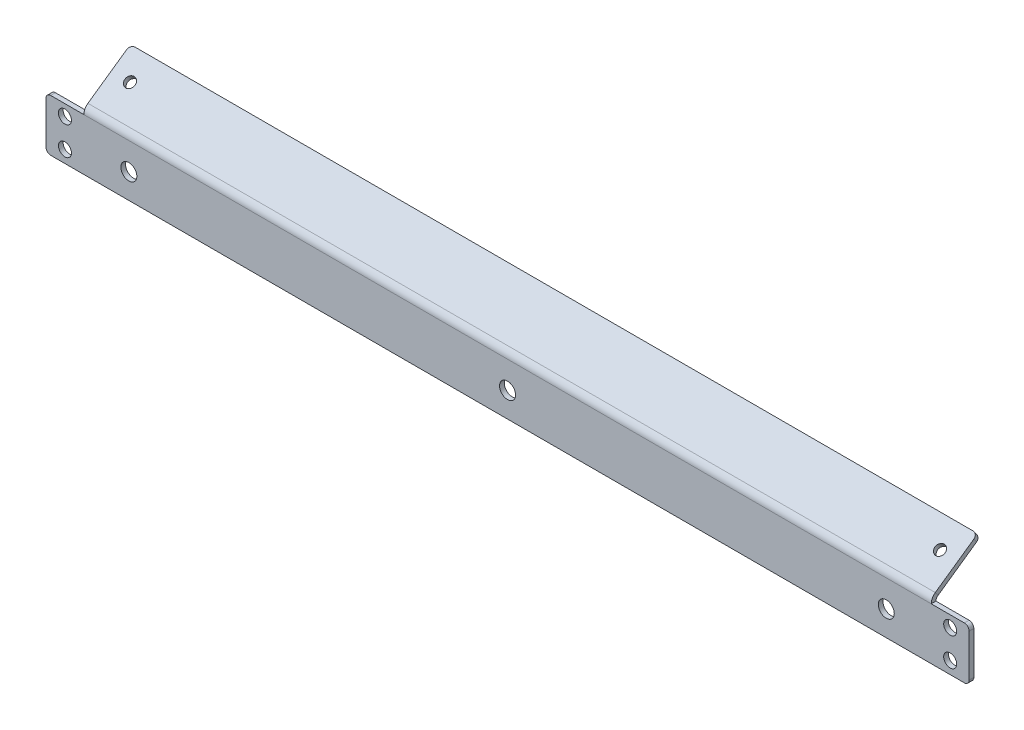
ISO-10303-21;
HEADER;
FILE_DESCRIPTION(('STEP AP214'),'2;1');
FILE_NAME('part.step','',(''),(''),'','','');
FILE_SCHEMA(('AUTOMOTIVE_DESIGN { 1 0 10303 214 1 1 1 1 }'));
ENDSEC;
DATA;
#1=APPLICATION_CONTEXT('core data for automotive mechanical design processes');
#2=APPLICATION_PROTOCOL_DEFINITION('international standard','automotive_design',2000,#1);
#3=PRODUCT_CONTEXT('',#1,'mechanical');
#4=PRODUCT('Part','Part','',(#3));
#5=PRODUCT_RELATED_PRODUCT_CATEGORY('part','',(#4));
#6=PRODUCT_DEFINITION_FORMATION('','',#4);
#7=PRODUCT_DEFINITION_CONTEXT('part definition',#1,'design');
#8=PRODUCT_DEFINITION('design','',#6,#7);
#9=PRODUCT_DEFINITION_SHAPE('','',#8);
#10=(LENGTH_UNIT() NAMED_UNIT(*) SI_UNIT(.MILLI.,.METRE.));
#11=(NAMED_UNIT(*) PLANE_ANGLE_UNIT() SI_UNIT($,.RADIAN.));
#12=(NAMED_UNIT(*) SI_UNIT($,.STERADIAN.) SOLID_ANGLE_UNIT());
#13=UNCERTAINTY_MEASURE_WITH_UNIT(LENGTH_MEASURE(1.E-05),#10,'distance_accuracy_value','');
#14=(GEOMETRIC_REPRESENTATION_CONTEXT(3) GLOBAL_UNCERTAINTY_ASSIGNED_CONTEXT((#13)) GLOBAL_UNIT_ASSIGNED_CONTEXT((#10,
#11,#12)) REPRESENTATION_CONTEXT('',''));
#15=CARTESIAN_POINT('',(0.,0.,0.));
#16=DIRECTION('',(0.,0.,1.));
#17=DIRECTION('',(1.,0.,0.));
#18=AXIS2_PLACEMENT_3D('',#15,#16,#17);
#19=CARTESIAN_POINT('',(612.775,34.7943992289964,-33.0307980728252));
#20=DIRECTION('',(-1.,0.,0.));
#21=DIRECTION('',(0.,0.,1.));
#22=AXIS2_PLACEMENT_3D('',#19,#20,#21);
#23=PLANE('',#22);
#24=DIRECTION('',(0.,-0.573576436351045,0.819152044288993));
#25=VECTOR('',#24,1.);
#26=CARTESIAN_POINT('',(612.775,35.4991922593825,-1.82110518541457));
#27=LINE('',#26,#25);
#28=CARTESIAN_POINT('',(612.775,55.5313492989427,-30.4299903322076));
#29=VERTEX_POINT('',#28);
#30=CARTESIAN_POINT('',(612.775,37.3952069696139,-4.52889481458543));
#31=VERTEX_POINT('',#30);
#32=EDGE_CURVE('E483',#29,#31,#27,.T.);
#33=ORIENTED_EDGE('',*,*,#32,.F.);
#34=DIRECTION('',(0.,0.819152044288992,0.573576436351046));
#35=VECTOR('',#34,1.);
#36=CARTESIAN_POINT('',(612.775,58.1321570395602,-28.6088851467931));
#37=LINE('',#36,#35);
#38=CARTESIAN_POINT('',(612.775,58.1321570395602,-28.6088851467931));
#39=VERTEX_POINT('',#38);
#40=EDGE_CURVE('E399',#29,#39,#37,.T.);
#41=ORIENTED_EDGE('',*,*,#40,.T.);
#42=DIRECTION('',(0.,-0.573576436351045,0.819152044288993));
#43=VECTOR('',#42,1.);
#44=CARTESIAN_POINT('',(612.775,38.1,0.));
#45=LINE('',#44,#43);
#46=CARTESIAN_POINT('',(612.775,39.9960147102315,-2.70778962917086));
#47=VERTEX_POINT('',#46);
#48=EDGE_CURVE('E272',#39,#47,#45,.T.);
#49=ORIENTED_EDGE('',*,*,#48,.T.);
#50=DIRECTION('',(0.,-0.819152044288993,-0.573576436351044));
#51=VECTOR('',#50,1.);
#52=CARTESIAN_POINT('',(612.775,39.9960147102315,-2.70778962917086));
#53=LINE('',#52,#51);
#54=EDGE_CURVE('E266',#47,#31,#53,.T.);
#55=ORIENTED_EDGE('',*,*,#54,.T.);
#56=EDGE_LOOP('',(#33,#41,#49,#55));
#57=FACE_BOUND('',#56,.T.);
#58=ADVANCED_FACE('F125',(#57),#23,.F.);
#59=CARTESIAN_POINT('',(638.175,35.4991922593825,-1.82110518541457));
#60=DIRECTION('',(0.,0.819152044288993,0.573576436351045));
#61=DIRECTION('',(0.,-0.573576436351045,0.819152044288993));
#62=AXIS2_PLACEMENT_3D('',#59,#60,#61);
#63=PLANE('',#62);
#64=CARTESIAN_POINT('',(57.15,48.2469285572844,-20.0267593697374));
#65=DIRECTION('',(0.,0.819152044288993,0.573576436351045));
#66=DIRECTION('',(0.,-0.573576436351045,0.819152044288993));
#67=AXIS2_PLACEMENT_3D('',#64,#65,#66);
#68=CIRCLE('',#67,3.429);
#69=CARTESIAN_POINT('',(57.15,46.2801349570367,-17.2178870098705));
#70=VERTEX_POINT('',#69);
#71=EDGE_CURVE('E899',#70,#70,#68,.T.);
#72=ORIENTED_EDGE('',*,*,#71,.T.);
#73=EDGE_LOOP('',(#72));
#74=FACE_BOUND('',#73,.T.);
#75=CARTESIAN_POINT('',(600.456,48.2469285572844,-20.0267593697374));
#76=DIRECTION('',(0.,0.819152044288993,0.573576436351045));
#77=DIRECTION('',(0.,-0.573576436351045,0.819152044288993));
#78=AXIS2_PLACEMENT_3D('',#75,#76,#77);
#79=CIRCLE('',#78,3.429);
#80=CARTESIAN_POINT('',(600.456,46.2801349570367,-17.2178870098705));
#81=VERTEX_POINT('',#80);
#82=EDGE_CURVE('E904',#81,#81,#79,.T.);
#83=ORIENTED_EDGE('',*,*,#82,.T.);
#84=EDGE_LOOP('',(#83));
#85=FACE_BOUND('',#84,.T.);
#86=DIRECTION('',(0.,0.573576436351045,-0.819152044288993));
#87=VECTOR('',#86,1.);
#88=CARTESIAN_POINT('',(44.45,35.4991922593825,-1.82110518541457));
#89=LINE('',#88,#87);
#90=CARTESIAN_POINT('',(44.45,37.3952069696139,-4.52889481458543));
#91=VERTEX_POINT('',#90);
#92=CARTESIAN_POINT('',(44.45,55.5313492989427,-30.4299903322076));
#93=VERTEX_POINT('',#92);
#94=EDGE_CURVE('E473',#91,#93,#89,.T.);
#95=ORIENTED_EDGE('',*,*,#94,.T.);
#96=CARTESIAN_POINT('',(47.625,55.5313492989427,-30.4299903322076));
#97=DIRECTION('',(0.,0.819152044288993,0.573576436351045));
#98=DIRECTION('',(0.,-0.573576436351045,0.819152044288993));
#99=AXIS2_PLACEMENT_3D('',#96,#97,#98);
#100=CIRCLE('',#99,3.175);
#101=CARTESIAN_POINT('',(47.625,57.3524544843573,-33.0307980728252));
#102=VERTEX_POINT('',#101);
#103=EDGE_CURVE('E386',#93,#102,#100,.F.);
#104=ORIENTED_EDGE('',*,*,#103,.T.);
#105=DIRECTION('',(-1.,0.,0.));
#106=VECTOR('',#105,1.);
#107=CARTESIAN_POINT('',(638.175,57.3524544843573,-33.0307980728252));
#108=LINE('',#107,#106);
#109=CARTESIAN_POINT('',(609.6,57.3524544843573,-33.0307980728252));
#110=VERTEX_POINT('',#109);
#111=EDGE_CURVE('E298',#110,#102,#108,.T.);
#112=ORIENTED_EDGE('',*,*,#111,.F.);
#113=CARTESIAN_POINT('',(609.6,55.5313492989427,-30.4299903322076));
#114=DIRECTION('',(0.,0.819152044288993,0.573576436351045));
#115=DIRECTION('',(0.,-0.573576436351045,0.819152044288993));
#116=AXIS2_PLACEMENT_3D('',#113,#114,#115);
#117=CIRCLE('',#116,3.175);
#118=EDGE_CURVE('E383',#110,#29,#117,.F.);
#119=ORIENTED_EDGE('',*,*,#118,.T.);
#120=ORIENTED_EDGE('',*,*,#32,.T.);
#121=DIRECTION('',(-1.,0.,0.));
#122=VECTOR('',#121,1.);
#123=CARTESIAN_POINT('',(638.175,37.395206969614,-4.52889481458542));
#124=LINE('',#123,#122);
#125=EDGE_CURVE('E422',#31,#91,#124,.T.);
#126=ORIENTED_EDGE('',*,*,#125,.T.);
#127=EDGE_LOOP('',(#95,#104,#112,#119,#120,#126));
#128=FACE_BOUND('',#127,.T.);
#129=ADVANCED_FACE('F501',(#74,#85,#128),#63,.F.);
#130=CARTESIAN_POINT('',(638.175,59.9532622249748,-31.2096928874106));
#131=DIRECTION('',(0.,0.573576436351045,-0.819152044288992));
#132=DIRECTION('',(0.,0.819152044288992,0.573576436351046));
#133=AXIS2_PLACEMENT_3D('',#130,#131,#132);
#134=PLANE('',#133);
#135=ORIENTED_EDGE('',*,*,#111,.T.);
#136=DIRECTION('',(0.,-0.819152044288992,-0.573576436351046));
#137=VECTOR('',#136,1.);
#138=CARTESIAN_POINT('',(47.625,59.9532622249748,-31.2096928874106));
#139=LINE('',#138,#137);
#140=CARTESIAN_POINT('',(47.625,59.9532622249748,-31.2096928874106));
#141=VERTEX_POINT('',#140);
#142=EDGE_CURVE('E149',#102,#141,#139,.F.);
#143=ORIENTED_EDGE('',*,*,#142,.T.);
#144=DIRECTION('',(-1.,0.,0.));
#145=VECTOR('',#144,1.);
#146=CARTESIAN_POINT('',(638.175,59.9532622249748,-31.2096928874106));
#147=LINE('',#146,#145);
#148=CARTESIAN_POINT('',(609.6,59.9532622249748,-31.2096928874106));
#149=VERTEX_POINT('',#148);
#150=EDGE_CURVE('E295',#149,#141,#147,.T.);
#151=ORIENTED_EDGE('',*,*,#150,.F.);
#152=DIRECTION('',(0.,0.819152044288992,0.573576436351046));
#153=VECTOR('',#152,1.);
#154=CARTESIAN_POINT('',(609.6,57.3524544843573,-33.0307980728252));
#155=LINE('',#154,#153);
#156=EDGE_CURVE('E389',#149,#110,#155,.F.);
#157=ORIENTED_EDGE('',*,*,#156,.T.);
#158=EDGE_LOOP('',(#135,#143,#151,#157));
#159=FACE_BOUND('',#158,.T.);
#160=ADVANCED_FACE('F503',(#159),#134,.T.);
#161=CARTESIAN_POINT('',(638.175,38.1,0.));
#162=DIRECTION('',(0.,0.819152044288993,0.573576436351045));
#163=DIRECTION('',(0.,-0.573576436351045,0.819152044288993));
#164=AXIS2_PLACEMENT_3D('',#161,#162,#163);
#165=PLANE('',#164);
#166=CARTESIAN_POINT('',(57.15,50.847736297902,-18.2056541843229));
#167=DIRECTION('',(0.,0.819152044288993,0.573576436351045));
#168=DIRECTION('',(0.,-0.573576436351045,0.819152044288993));
#169=AXIS2_PLACEMENT_3D('',#166,#167,#168);
#170=CIRCLE('',#169,3.429);
#171=CARTESIAN_POINT('',(57.15,48.8809426976542,-15.3967818244559));
#172=VERTEX_POINT('',#171);
#173=EDGE_CURVE('E902',#172,#172,#170,.T.);
#174=ORIENTED_EDGE('',*,*,#173,.F.);
#175=EDGE_LOOP('',(#174));
#176=FACE_BOUND('',#175,.T.);
#177=CARTESIAN_POINT('',(600.456,50.847736297902,-18.2056541843229));
#178=DIRECTION('',(0.,0.819152044288993,0.573576436351045));
#179=DIRECTION('',(0.,-0.573576436351045,0.819152044288993));
#180=AXIS2_PLACEMENT_3D('',#177,#178,#179);
#181=CIRCLE('',#180,3.429);
#182=CARTESIAN_POINT('',(600.456,48.8809426976542,-15.3967818244559));
#183=VERTEX_POINT('',#182);
#184=EDGE_CURVE('E912',#183,#183,#181,.T.);
#185=ORIENTED_EDGE('',*,*,#184,.F.);
#186=EDGE_LOOP('',(#185));
#187=FACE_BOUND('',#186,.T.);
#188=ORIENTED_EDGE('',*,*,#150,.T.);
#189=CARTESIAN_POINT('',(47.625,58.1321570395602,-28.6088851467931));
#190=DIRECTION('',(0.,0.819152044288993,0.573576436351045));
#191=DIRECTION('',(0.,-0.573576436351045,0.819152044288993));
#192=AXIS2_PLACEMENT_3D('',#189,#190,#191);
#193=CIRCLE('',#192,3.175);
#194=CARTESIAN_POINT('',(44.45,58.1321570395602,-28.6088851467931));
#195=VERTEX_POINT('',#194);
#196=EDGE_CURVE('E396',#141,#195,#193,.T.);
#197=ORIENTED_EDGE('',*,*,#196,.T.);
#198=DIRECTION('',(0.,0.573576436351045,-0.819152044288993));
#199=VECTOR('',#198,1.);
#200=CARTESIAN_POINT('',(44.45,38.1,0.));
#201=LINE('',#200,#199);
#202=CARTESIAN_POINT('',(44.45,39.9960147102315,-2.70778962917086));
#203=VERTEX_POINT('',#202);
#204=EDGE_CURVE('E477',#203,#195,#201,.T.);
#205=ORIENTED_EDGE('',*,*,#204,.F.);
#206=DIRECTION('',(-1.,0.,0.));
#207=VECTOR('',#206,1.);
#208=CARTESIAN_POINT('',(638.175,39.9960147102315,-2.70778962917086));
#209=LINE('',#208,#207);
#210=EDGE_CURVE('E254',#47,#203,#209,.T.);
#211=ORIENTED_EDGE('',*,*,#210,.F.);
#212=ORIENTED_EDGE('',*,*,#48,.F.);
#213=CARTESIAN_POINT('',(609.6,58.1321570395602,-28.6088851467931));
#214=DIRECTION('',(0.,0.819152044288993,0.573576436351045));
#215=DIRECTION('',(0.,-0.573576436351045,0.819152044288993));
#216=AXIS2_PLACEMENT_3D('',#213,#214,#215);
#217=CIRCLE('',#216,3.175);
#218=EDGE_CURVE('E141',#39,#149,#217,.T.);
#219=ORIENTED_EDGE('',*,*,#218,.T.);
#220=EDGE_LOOP('',(#188,#197,#205,#211,#212,#219));
#221=FACE_BOUND('',#220,.T.);
#222=ADVANCED_FACE('F491',(#176,#187,#221),#165,.T.);
#223=CARTESIAN_POINT('',(638.175,34.7943992289964,-6.35));
#224=DIRECTION('',(-1.,0.,0.));
#225=DIRECTION('',(0.,0.,1.));
#226=AXIS2_PLACEMENT_3D('',#223,#224,#225);
#227=CYLINDRICAL_SURFACE('',#226,6.35);
#228=CARTESIAN_POINT('',(612.775,34.7943992289964,-6.35));
#229=DIRECTION('',(-1.,0.,0.));
#230=DIRECTION('',(0.,0.,1.));
#231=AXIS2_PLACEMENT_3D('',#228,#229,#230);
#232=CIRCLE('',#231,6.35);
#233=CARTESIAN_POINT('',(612.775,34.7943992289964,0.));
#234=VERTEX_POINT('',#233);
#235=EDGE_CURVE('E260',#47,#234,#232,.F.);
#236=ORIENTED_EDGE('',*,*,#235,.F.);
#237=ORIENTED_EDGE('',*,*,#210,.T.);
#238=CARTESIAN_POINT('',(44.45,34.7943992289964,-6.35));
#239=DIRECTION('',(1.,0.,0.));
#240=DIRECTION('',(0.,0.,-1.));
#241=AXIS2_PLACEMENT_3D('',#238,#239,#240);
#242=CIRCLE('',#241,6.35);
#243=CARTESIAN_POINT('',(44.45,34.7943992289964,0.));
#244=VERTEX_POINT('',#243);
#245=EDGE_CURVE('E283',#244,#203,#242,.F.);
#246=ORIENTED_EDGE('',*,*,#245,.F.);
#247=DIRECTION('',(-1.,0.,0.));
#248=VECTOR('',#247,1.);
#249=CARTESIAN_POINT('',(638.175,34.7943992289964,0.));
#250=LINE('',#249,#248);
#251=EDGE_CURVE('E247',#234,#244,#250,.T.);
#252=ORIENTED_EDGE('',*,*,#251,.F.);
#253=EDGE_LOOP('',(#236,#237,#246,#252));
#254=FACE_BOUND('',#253,.T.);
#255=ADVANCED_FACE('F282',(#254),#227,.T.);
#256=CARTESIAN_POINT('',(638.175,0.,0.));
#257=DIRECTION('',(0.,0.,1.));
#258=DIRECTION('',(1.,0.,0.));
#259=AXIS2_PLACEMENT_3D('',#256,#257,#258);
#260=PLANE('',#259);
#261=CARTESIAN_POINT('',(74.6124999999999,16.6920911299752,0.));
#262=DIRECTION('',(0.,0.,1.));
#263=DIRECTION('',(1.,0.,0.));
#264=AXIS2_PLACEMENT_3D('',#261,#262,#263);
#265=CIRCLE('',#264,5.3578125);
#266=CARTESIAN_POINT('',(79.9703124999999,16.6920911299752,0.));
#267=VERTEX_POINT('',#266);
#268=EDGE_CURVE('E278',#267,#267,#265,.T.);
#269=ORIENTED_EDGE('',*,*,#268,.F.);
#270=EDGE_LOOP('',(#269));
#271=FACE_BOUND('',#270,.T.);
#272=CARTESIAN_POINT('',(31.75,27.305,0.));
#273=DIRECTION('',(0.,0.,1.));
#274=DIRECTION('',(1.,0.,0.));
#275=AXIS2_PLACEMENT_3D('',#272,#273,#274);
#276=CIRCLE('',#275,4.3688);
#277=CARTESIAN_POINT('',(36.1188,27.305,0.));
#278=VERTEX_POINT('',#277);
#279=EDGE_CURVE('E279',#278,#278,#276,.T.);
#280=ORIENTED_EDGE('',*,*,#279,.F.);
#281=EDGE_LOOP('',(#280));
#282=FACE_BOUND('',#281,.T.);
#283=CARTESIAN_POINT('',(31.7499999999999,8.255,0.));
#284=DIRECTION('',(0.,0.,1.));
#285=DIRECTION('',(1.,0.,0.));
#286=AXIS2_PLACEMENT_3D('',#283,#284,#285);
#287=CIRCLE('',#286,4.3688);
#288=CARTESIAN_POINT('',(36.1187999999999,8.255,0.));
#289=VERTEX_POINT('',#288);
#290=EDGE_CURVE('E465',#289,#289,#287,.T.);
#291=ORIENTED_EDGE('',*,*,#290,.F.);
#292=EDGE_LOOP('',(#291));
#293=FACE_BOUND('',#292,.T.);
#294=CARTESIAN_POINT('',(625.475,27.305,0.));
#295=DIRECTION('',(0.,0.,1.));
#296=DIRECTION('',(1.,0.,0.));
#297=AXIS2_PLACEMENT_3D('',#294,#295,#296);
#298=CIRCLE('',#297,4.36879999999994);
#299=CARTESIAN_POINT('',(629.8438,27.305,0.));
#300=VERTEX_POINT('',#299);
#301=EDGE_CURVE('E918',#300,#300,#298,.T.);
#302=ORIENTED_EDGE('',*,*,#301,.F.);
#303=EDGE_LOOP('',(#302));
#304=FACE_BOUND('',#303,.T.);
#305=CARTESIAN_POINT('',(625.475,8.255,0.));
#306=DIRECTION('',(0.,0.,1.));
#307=DIRECTION('',(1.,0.,0.));
#308=AXIS2_PLACEMENT_3D('',#305,#306,#307);
#309=CIRCLE('',#308,4.36879999999994);
#310=CARTESIAN_POINT('',(629.8438,8.255,0.));
#311=VERTEX_POINT('',#310);
#312=EDGE_CURVE('E922',#311,#311,#309,.T.);
#313=ORIENTED_EDGE('',*,*,#312,.F.);
#314=EDGE_LOOP('',(#313));
#315=FACE_BOUND('',#314,.T.);
#316=CARTESIAN_POINT('',(328.6125,16.6920911299752,0.));
#317=DIRECTION('',(0.,0.,1.));
#318=DIRECTION('',(1.,0.,0.));
#319=AXIS2_PLACEMENT_3D('',#316,#317,#318);
#320=CIRCLE('',#319,5.35781249999997);
#321=CARTESIAN_POINT('',(333.9703125,16.6920911299752,0.));
#322=VERTEX_POINT('',#321);
#323=EDGE_CURVE('E926',#322,#322,#320,.T.);
#324=ORIENTED_EDGE('',*,*,#323,.F.);
#325=EDGE_LOOP('',(#324));
#326=FACE_BOUND('',#325,.T.);
#327=CARTESIAN_POINT('',(582.6125,16.6920911299752,0.));
#328=DIRECTION('',(0.,0.,1.));
#329=DIRECTION('',(1.,0.,0.));
#330=AXIS2_PLACEMENT_3D('',#327,#328,#329);
#331=CIRCLE('',#330,5.35781249999997);
#332=CARTESIAN_POINT('',(587.9703125,16.6920911299752,0.));
#333=VERTEX_POINT('',#332);
#334=EDGE_CURVE('E909',#333,#333,#331,.T.);
#335=ORIENTED_EDGE('',*,*,#334,.F.);
#336=EDGE_LOOP('',(#335));
#337=FACE_BOUND('',#336,.T.);
#338=DIRECTION('',(0.,1.,0.));
#339=VECTOR('',#338,1.);
#340=CARTESIAN_POINT('',(19.0499999999999,34.7943992289964,0.));
#341=LINE('',#340,#339);
#342=CARTESIAN_POINT('',(19.0499999999999,3.175,0.));
#343=VERTEX_POINT('',#342);
#344=CARTESIAN_POINT('',(19.0499999999999,31.6193992289964,0.));
#345=VERTEX_POINT('',#344);
#346=EDGE_CURVE('E451',#343,#345,#341,.T.);
#347=ORIENTED_EDGE('',*,*,#346,.F.);
#348=CARTESIAN_POINT('',(22.2249999999999,3.175,0.));
#349=DIRECTION('',(0.,0.,1.));
#350=DIRECTION('',(1.,0.,0.));
#351=AXIS2_PLACEMENT_3D('',#348,#349,#350);
#352=CIRCLE('',#351,3.175);
#353=CARTESIAN_POINT('',(22.2249999999999,0.,0.));
#354=VERTEX_POINT('',#353);
#355=EDGE_CURVE('E353',#343,#354,#352,.T.);
#356=ORIENTED_EDGE('',*,*,#355,.T.);
#357=DIRECTION('',(-1.,0.,0.));
#358=VECTOR('',#357,1.);
#359=CARTESIAN_POINT('',(638.175,0.,0.));
#360=LINE('',#359,#358);
#361=CARTESIAN_POINT('',(635.,0.,0.));
#362=VERTEX_POINT('',#361);
#363=EDGE_CURVE('E285',#362,#354,#360,.T.);
#364=ORIENTED_EDGE('',*,*,#363,.F.);
#365=CARTESIAN_POINT('',(635.,3.175,0.));
#366=DIRECTION('',(0.,0.,1.));
#367=DIRECTION('',(1.,0.,0.));
#368=AXIS2_PLACEMENT_3D('',#365,#366,#367);
#369=CIRCLE('',#368,3.175);
#370=CARTESIAN_POINT('',(638.175,3.175,0.));
#371=VERTEX_POINT('',#370);
#372=EDGE_CURVE('E345',#362,#371,#369,.T.);
#373=ORIENTED_EDGE('',*,*,#372,.T.);
#374=DIRECTION('',(0.,1.,0.));
#375=VECTOR('',#374,1.);
#376=CARTESIAN_POINT('',(638.175,0.,0.));
#377=LINE('',#376,#375);
#378=CARTESIAN_POINT('',(638.175,31.6193992289964,0.));
#379=VERTEX_POINT('',#378);
#380=EDGE_CURVE('E335',#371,#379,#377,.T.);
#381=ORIENTED_EDGE('',*,*,#380,.T.);
#382=CARTESIAN_POINT('',(635.,31.6193992289964,0.));
#383=DIRECTION('',(0.,0.,1.));
#384=DIRECTION('',(1.,0.,0.));
#385=AXIS2_PLACEMENT_3D('',#382,#383,#384);
#386=CIRCLE('',#385,3.175);
#387=CARTESIAN_POINT('',(635.,34.7943992289964,0.));
#388=VERTEX_POINT('',#387);
#389=EDGE_CURVE('E249',#379,#388,#386,.T.);
#390=ORIENTED_EDGE('',*,*,#389,.T.);
#391=EDGE_CURVE('E241',#388,#234,#250,.T.);
#392=ORIENTED_EDGE('',*,*,#391,.T.);
#393=ORIENTED_EDGE('',*,*,#251,.T.);
#394=DIRECTION('',(1.,0.,0.));
#395=VECTOR('',#394,1.);
#396=CARTESIAN_POINT('',(19.0499999999999,34.7943992289964,0.));
#397=LINE('',#396,#395);
#398=CARTESIAN_POINT('',(22.2249999999999,34.7943992289964,0.));
#399=VERTEX_POINT('',#398);
#400=EDGE_CURVE('E455',#399,#244,#397,.T.);
#401=ORIENTED_EDGE('',*,*,#400,.F.);
#402=CARTESIAN_POINT('',(22.2249999999999,31.6193992289964,0.));
#403=DIRECTION('',(0.,0.,1.));
#404=DIRECTION('',(1.,0.,0.));
#405=AXIS2_PLACEMENT_3D('',#402,#403,#404);
#406=CIRCLE('',#405,3.175);
#407=EDGE_CURVE('E350',#399,#345,#406,.T.);
#408=ORIENTED_EDGE('',*,*,#407,.T.);
#409=EDGE_LOOP('',(#347,#356,#364,#373,#381,#390,#392,#393,#401,#408));
#410=FACE_BOUND('',#409,.T.);
#411=ADVANCED_FACE('F244',(#271,#282,#293,#304,#315,#326,#337,#410),#260,.T.);
#412=CARTESIAN_POINT('',(638.175,0.,-3.175));
#413=DIRECTION('',(0.,-1.,0.));
#414=DIRECTION('',(0.,0.,-1.));
#415=AXIS2_PLACEMENT_3D('',#412,#413,#414);
#416=PLANE('',#415);
#417=ORIENTED_EDGE('',*,*,#363,.T.);
#418=DIRECTION('',(0.,0.,1.));
#419=VECTOR('',#418,1.);
#420=CARTESIAN_POINT('',(22.2249999999999,0.,-3.175));
#421=LINE('',#420,#419);
#422=CARTESIAN_POINT('',(22.2249999999999,0.,-3.175));
#423=VERTEX_POINT('',#422);
#424=EDGE_CURVE('E360',#354,#423,#421,.F.);
#425=ORIENTED_EDGE('',*,*,#424,.T.);
#426=DIRECTION('',(-1.,0.,0.));
#427=VECTOR('',#426,1.);
#428=CARTESIAN_POINT('',(638.175,0.,-3.175));
#429=LINE('',#428,#427);
#430=CARTESIAN_POINT('',(635.,0.,-3.175));
#431=VERTEX_POINT('',#430);
#432=EDGE_CURVE('E289',#431,#423,#429,.T.);
#433=ORIENTED_EDGE('',*,*,#432,.F.);
#434=DIRECTION('',(0.,0.,1.));
#435=VECTOR('',#434,1.);
#436=CARTESIAN_POINT('',(635.,0.,-3.175));
#437=LINE('',#436,#435);
#438=EDGE_CURVE('E356',#431,#362,#437,.T.);
#439=ORIENTED_EDGE('',*,*,#438,.T.);
#440=EDGE_LOOP('',(#417,#425,#433,#439));
#441=FACE_BOUND('',#440,.T.);
#442=ADVANCED_FACE('F559',(#441),#416,.T.);
#443=CARTESIAN_POINT('',(638.175,0.,-3.175));
#444=DIRECTION('',(0.,0.,1.));
#445=DIRECTION('',(1.,0.,0.));
#446=AXIS2_PLACEMENT_3D('',#443,#444,#445);
#447=PLANE('',#446);
#448=CARTESIAN_POINT('',(74.6124999999999,16.6920911299752,-3.175));
#449=DIRECTION('',(0.,0.,1.));
#450=DIRECTION('',(1.,0.,0.));
#451=AXIS2_PLACEMENT_3D('',#448,#449,#450);
#452=CIRCLE('',#451,5.3578125);
#453=CARTESIAN_POINT('',(79.9703124999999,16.6920911299752,-3.175));
#454=VERTEX_POINT('',#453);
#455=EDGE_CURVE('E331',#454,#454,#452,.T.);
#456=ORIENTED_EDGE('',*,*,#455,.T.);
#457=EDGE_LOOP('',(#456));
#458=FACE_BOUND('',#457,.T.);
#459=CARTESIAN_POINT('',(31.75,27.305,-3.175));
#460=DIRECTION('',(0.,0.,1.));
#461=DIRECTION('',(1.,0.,0.));
#462=AXIS2_PLACEMENT_3D('',#459,#460,#461);
#463=CIRCLE('',#462,4.3688);
#464=CARTESIAN_POINT('',(36.1188,27.305,-3.175));
#465=VERTEX_POINT('',#464);
#466=EDGE_CURVE('E327',#465,#465,#463,.T.);
#467=ORIENTED_EDGE('',*,*,#466,.T.);
#468=EDGE_LOOP('',(#467));
#469=FACE_BOUND('',#468,.T.);
#470=CARTESIAN_POINT('',(31.7499999999999,8.255,-3.175));
#471=DIRECTION('',(0.,0.,1.));
#472=DIRECTION('',(1.,0.,0.));
#473=AXIS2_PLACEMENT_3D('',#470,#471,#472);
#474=CIRCLE('',#473,4.3688);
#475=CARTESIAN_POINT('',(36.1187999999999,8.255,-3.175));
#476=VERTEX_POINT('',#475);
#477=EDGE_CURVE('E323',#476,#476,#474,.T.);
#478=ORIENTED_EDGE('',*,*,#477,.T.);
#479=EDGE_LOOP('',(#478));
#480=FACE_BOUND('',#479,.T.);
#481=CARTESIAN_POINT('',(625.475,27.305,-3.175));
#482=DIRECTION('',(0.,0.,1.));
#483=DIRECTION('',(1.,0.,0.));
#484=AXIS2_PLACEMENT_3D('',#481,#482,#483);
#485=CIRCLE('',#484,4.36879999999994);
#486=CARTESIAN_POINT('',(629.8438,27.305,-3.175));
#487=VERTEX_POINT('',#486);
#488=EDGE_CURVE('E319',#487,#487,#485,.T.);
#489=ORIENTED_EDGE('',*,*,#488,.T.);
#490=EDGE_LOOP('',(#489));
#491=FACE_BOUND('',#490,.T.);
#492=CARTESIAN_POINT('',(625.475,8.255,-3.175));
#493=DIRECTION('',(0.,0.,1.));
#494=DIRECTION('',(1.,0.,0.));
#495=AXIS2_PLACEMENT_3D('',#492,#493,#494);
#496=CIRCLE('',#495,4.36879999999994);
#497=CARTESIAN_POINT('',(629.8438,8.255,-3.175));
#498=VERTEX_POINT('',#497);
#499=EDGE_CURVE('E315',#498,#498,#496,.T.);
#500=ORIENTED_EDGE('',*,*,#499,.T.);
#501=EDGE_LOOP('',(#500));
#502=FACE_BOUND('',#501,.T.);
#503=CARTESIAN_POINT('',(328.6125,16.6920911299752,-3.175));
#504=DIRECTION('',(0.,0.,1.));
#505=DIRECTION('',(1.,0.,0.));
#506=AXIS2_PLACEMENT_3D('',#503,#504,#505);
#507=CIRCLE('',#506,5.35781249999997);
#508=CARTESIAN_POINT('',(333.9703125,16.6920911299752,-3.175));
#509=VERTEX_POINT('',#508);
#510=EDGE_CURVE('E311',#509,#509,#507,.T.);
#511=ORIENTED_EDGE('',*,*,#510,.T.);
#512=EDGE_LOOP('',(#511));
#513=FACE_BOUND('',#512,.T.);
#514=CARTESIAN_POINT('',(582.6125,16.6920911299752,-3.175));
#515=DIRECTION('',(0.,0.,1.));
#516=DIRECTION('',(1.,0.,0.));
#517=AXIS2_PLACEMENT_3D('',#514,#515,#516);
#518=CIRCLE('',#517,5.35781249999997);
#519=CARTESIAN_POINT('',(587.9703125,16.6920911299752,-3.175));
#520=VERTEX_POINT('',#519);
#521=EDGE_CURVE('E271',#520,#520,#518,.T.);
#522=ORIENTED_EDGE('',*,*,#521,.T.);
#523=EDGE_LOOP('',(#522));
#524=FACE_BOUND('',#523,.T.);
#525=ORIENTED_EDGE('',*,*,#432,.T.);
#526=CARTESIAN_POINT('',(22.2249999999999,3.175,-3.175));
#527=DIRECTION('',(0.,0.,1.));
#528=DIRECTION('',(1.,0.,0.));
#529=AXIS2_PLACEMENT_3D('',#526,#527,#528);
#530=CIRCLE('',#529,3.175);
#531=CARTESIAN_POINT('',(19.0499999999999,3.175,-3.175));
#532=VERTEX_POINT('',#531);
#533=EDGE_CURVE('E372',#423,#532,#530,.F.);
#534=ORIENTED_EDGE('',*,*,#533,.T.);
#535=DIRECTION('',(0.,1.,0.));
#536=VECTOR('',#535,1.);
#537=CARTESIAN_POINT('',(19.0499999999999,8.02550930392171E-13,-3.175));
#538=LINE('',#537,#536);
#539=CARTESIAN_POINT('',(19.0499999999999,31.6193992289964,-3.175));
#540=VERTEX_POINT('',#539);
#541=EDGE_CURVE('E453',#532,#540,#538,.T.);
#542=ORIENTED_EDGE('',*,*,#541,.T.);
#543=CARTESIAN_POINT('',(22.2249999999999,31.6193992289964,-3.175));
#544=DIRECTION('',(0.,0.,1.));
#545=DIRECTION('',(1.,0.,0.));
#546=AXIS2_PLACEMENT_3D('',#543,#544,#545);
#547=CIRCLE('',#546,3.175);
#548=CARTESIAN_POINT('',(22.2249999999999,34.7943992289964,-3.175));
#549=VERTEX_POINT('',#548);
#550=EDGE_CURVE('E369',#540,#549,#547,.F.);
#551=ORIENTED_EDGE('',*,*,#550,.T.);
#552=DIRECTION('',(-1.,0.,0.));
#553=VECTOR('',#552,1.);
#554=CARTESIAN_POINT('',(638.175,34.7943992289964,-3.175));
#555=LINE('',#554,#553);
#556=CARTESIAN_POINT('',(44.45,34.7943992289964,-3.175));
#557=VERTEX_POINT('',#556);
#558=EDGE_CURVE('E429',#557,#549,#555,.T.);
#559=ORIENTED_EDGE('',*,*,#558,.F.);
#560=CARTESIAN_POINT('',(612.775,34.7943992289964,-3.175));
#561=VERTEX_POINT('',#560);
#562=EDGE_CURVE('E431',#561,#557,#555,.T.);
#563=ORIENTED_EDGE('',*,*,#562,.F.);
#564=CARTESIAN_POINT('',(635.,34.7943992289964,-3.175));
#565=VERTEX_POINT('',#564);
#566=EDGE_CURVE('E276',#565,#561,#555,.T.);
#567=ORIENTED_EDGE('',*,*,#566,.F.);
#568=CARTESIAN_POINT('',(635.,31.6193992289964,-3.175));
#569=DIRECTION('',(0.,0.,1.));
#570=DIRECTION('',(1.,0.,0.));
#571=AXIS2_PLACEMENT_3D('',#568,#569,#570);
#572=CIRCLE('',#571,3.175);
#573=CARTESIAN_POINT('',(638.175,31.6193992289964,-3.175));
#574=VERTEX_POINT('',#573);
#575=EDGE_CURVE('E366',#565,#574,#572,.F.);
#576=ORIENTED_EDGE('',*,*,#575,.T.);
#577=DIRECTION('',(0.,1.,0.));
#578=VECTOR('',#577,1.);
#579=CARTESIAN_POINT('',(638.175,0.,-3.175));
#580=LINE('',#579,#578);
#581=CARTESIAN_POINT('',(638.175,3.175,-3.175));
#582=VERTEX_POINT('',#581);
#583=EDGE_CURVE('E414',#582,#574,#580,.T.);
#584=ORIENTED_EDGE('',*,*,#583,.F.);
#585=CARTESIAN_POINT('',(635.,3.175,-3.175));
#586=DIRECTION('',(0.,0.,1.));
#587=DIRECTION('',(1.,0.,0.));
#588=AXIS2_PLACEMENT_3D('',#585,#586,#587);
#589=CIRCLE('',#588,3.175);
#590=EDGE_CURVE('E363',#582,#431,#589,.F.);
#591=ORIENTED_EDGE('',*,*,#590,.T.);
#592=EDGE_LOOP('',(#525,#534,#542,#551,#559,#563,#567,#576,#584,#591));
#593=FACE_BOUND('',#592,.T.);
#594=ADVANCED_FACE('F438',(#458,#469,#480,#491,#502,#513,#524,#593),#447,.F.);
#595=CARTESIAN_POINT('',(638.175,34.7943992289964,-6.35));
#596=DIRECTION('',(-1.,0.,0.));
#597=DIRECTION('',(0.,0.,1.));
#598=AXIS2_PLACEMENT_3D('',#595,#596,#597);
#599=CYLINDRICAL_SURFACE('',#598,3.175);
#600=ORIENTED_EDGE('',*,*,#125,.F.);
#601=CARTESIAN_POINT('',(612.775,34.7943992289964,-6.35));
#602=DIRECTION('',(-1.,0.,0.));
#603=DIRECTION('',(0.,0.,1.));
#604=AXIS2_PLACEMENT_3D('',#601,#602,#603);
#605=CIRCLE('',#604,3.175);
#606=EDGE_CURVE('E305',#31,#561,#605,.F.);
#607=ORIENTED_EDGE('',*,*,#606,.T.);
#608=ORIENTED_EDGE('',*,*,#562,.T.);
#609=CARTESIAN_POINT('',(44.45,34.7943992289964,-6.35));
#610=DIRECTION('',(1.,0.,0.));
#611=DIRECTION('',(0.,0.,-1.));
#612=AXIS2_PLACEMENT_3D('',#609,#610,#611);
#613=CIRCLE('',#612,3.175);
#614=EDGE_CURVE('E301',#557,#91,#613,.F.);
#615=ORIENTED_EDGE('',*,*,#614,.T.);
#616=EDGE_LOOP('',(#600,#607,#608,#615));
#617=FACE_BOUND('',#616,.T.);
#618=ADVANCED_FACE('F507',(#617),#599,.F.);
#619=CARTESIAN_POINT('',(638.175,34.7943992289964,-6.35));
#620=DIRECTION('',(1.,0.,0.));
#621=DIRECTION('',(0.,0.,-1.));
#622=AXIS2_PLACEMENT_3D('',#619,#620,#621);
#623=PLANE('',#622);
#624=ORIENTED_EDGE('',*,*,#583,.T.);
#625=DIRECTION('',(0.,0.,1.));
#626=VECTOR('',#625,1.);
#627=CARTESIAN_POINT('',(638.175,31.6193992289964,0.));
#628=LINE('',#627,#626);
#629=EDGE_CURVE('E134',#574,#379,#628,.T.);
#630=ORIENTED_EDGE('',*,*,#629,.T.);
#631=ORIENTED_EDGE('',*,*,#380,.F.);
#632=DIRECTION('',(0.,0.,1.));
#633=VECTOR('',#632,1.);
#634=CARTESIAN_POINT('',(638.175,3.175,-6.35));
#635=LINE('',#634,#633);
#636=EDGE_CURVE('E402',#371,#582,#635,.F.);
#637=ORIENTED_EDGE('',*,*,#636,.T.);
#638=EDGE_LOOP('',(#624,#630,#631,#637));
#639=FACE_BOUND('',#638,.T.);
#640=ADVANCED_FACE('F411',(#639),#623,.T.);
#641=ORIENTED_EDGE('',*,*,#54,.F.);
#642=ORIENTED_EDGE('',*,*,#235,.T.);
#643=DIRECTION('',(0.,0.,1.));
#644=VECTOR('',#643,1.);
#645=CARTESIAN_POINT('',(612.775,34.7943992289964,-33.0307980728252));
#646=LINE('',#645,#644);
#647=EDGE_CURVE('E263',#561,#234,#646,.T.);
#648=ORIENTED_EDGE('',*,*,#647,.F.);
#649=ORIENTED_EDGE('',*,*,#606,.F.);
#650=EDGE_LOOP('',(#641,#642,#648,#649));
#651=FACE_BOUND('',#650,.T.);
#652=ADVANCED_FACE('F261',(#651),#23,.F.);
#653=CARTESIAN_POINT('',(638.175,34.7943992289964,-33.0307980728252));
#654=DIRECTION('',(0.,-1.,0.));
#655=DIRECTION('',(0.,0.,-1.));
#656=AXIS2_PLACEMENT_3D('',#653,#654,#655);
#657=PLANE('',#656);
#658=ORIENTED_EDGE('',*,*,#391,.F.);
#659=DIRECTION('',(0.,0.,1.));
#660=VECTOR('',#659,1.);
#661=CARTESIAN_POINT('',(635.,34.7943992289964,-3.175));
#662=LINE('',#661,#660);
#663=EDGE_CURVE('E14',#388,#565,#662,.F.);
#664=ORIENTED_EDGE('',*,*,#663,.T.);
#665=ORIENTED_EDGE('',*,*,#566,.T.);
#666=ORIENTED_EDGE('',*,*,#647,.T.);
#667=EDGE_LOOP('',(#658,#664,#665,#666));
#668=FACE_BOUND('',#667,.T.);
#669=ADVANCED_FACE('F274',(#668),#657,.F.);
#670=CARTESIAN_POINT('',(44.45,34.7943992289964,-33.0307980728252));
#671=DIRECTION('',(1.,0.,0.));
#672=DIRECTION('',(0.,0.,-1.));
#673=AXIS2_PLACEMENT_3D('',#670,#671,#672);
#674=PLANE('',#673);
#675=ORIENTED_EDGE('',*,*,#204,.T.);
#676=DIRECTION('',(0.,-0.819152044288992,-0.573576436351046));
#677=VECTOR('',#676,1.);
#678=CARTESIAN_POINT('',(44.45,55.5313492989427,-30.4299903322076));
#679=LINE('',#678,#677);
#680=EDGE_CURVE('E379',#195,#93,#679,.T.);
#681=ORIENTED_EDGE('',*,*,#680,.T.);
#682=ORIENTED_EDGE('',*,*,#94,.F.);
#683=ORIENTED_EDGE('',*,*,#614,.F.);
#684=DIRECTION('',(0.,0.,1.));
#685=VECTOR('',#684,1.);
#686=CARTESIAN_POINT('',(44.45,34.7943992289964,-33.0307980728252));
#687=LINE('',#686,#685);
#688=EDGE_CURVE('E460',#557,#244,#687,.T.);
#689=ORIENTED_EDGE('',*,*,#688,.T.);
#690=ORIENTED_EDGE('',*,*,#245,.T.);
#691=EDGE_LOOP('',(#675,#681,#682,#683,#689,#690));
#692=FACE_BOUND('',#691,.T.);
#693=ADVANCED_FACE('F496',(#692),#674,.F.);
#694=CARTESIAN_POINT('',(19.0499999999999,34.7943992289964,-33.0307980728252));
#695=DIRECTION('',(0.,-1.,0.));
#696=DIRECTION('',(0.,0.,-1.));
#697=AXIS2_PLACEMENT_3D('',#694,#695,#696);
#698=PLANE('',#697);
#699=ORIENTED_EDGE('',*,*,#558,.T.);
#700=DIRECTION('',(0.,0.,1.));
#701=VECTOR('',#700,1.);
#702=CARTESIAN_POINT('',(22.2249999999999,34.7943992289964,-33.0307980728252));
#703=LINE('',#702,#701);
#704=EDGE_CURVE('E375',#549,#399,#703,.T.);
#705=ORIENTED_EDGE('',*,*,#704,.T.);
#706=ORIENTED_EDGE('',*,*,#400,.T.);
#707=ORIENTED_EDGE('',*,*,#688,.F.);
#708=EDGE_LOOP('',(#699,#705,#706,#707));
#709=FACE_BOUND('',#708,.T.);
#710=ADVANCED_FACE('F523',(#709),#698,.F.);
#711=CARTESIAN_POINT('',(19.0499999999999,34.7943992289964,-33.0307980728252));
#712=DIRECTION('',(1.,0.,0.));
#713=DIRECTION('',(0.,1.,0.));
#714=AXIS2_PLACEMENT_3D('',#711,#712,#713);
#715=PLANE('',#714);
#716=ORIENTED_EDGE('',*,*,#541,.F.);
#717=DIRECTION('',(0.,0.,1.));
#718=VECTOR('',#717,1.);
#719=CARTESIAN_POINT('',(19.0499999999999,3.175,0.));
#720=LINE('',#719,#718);
#721=EDGE_CURVE('E341',#532,#343,#720,.T.);
#722=ORIENTED_EDGE('',*,*,#721,.T.);
#723=ORIENTED_EDGE('',*,*,#346,.T.);
#724=DIRECTION('',(0.,0.,1.));
#725=VECTOR('',#724,1.);
#726=CARTESIAN_POINT('',(19.0499999999999,31.6193992289964,-33.0307980728252));
#727=LINE('',#726,#725);
#728=EDGE_CURVE('E338',#345,#540,#727,.F.);
#729=ORIENTED_EDGE('',*,*,#728,.T.);
#730=EDGE_LOOP('',(#716,#722,#723,#729));
#731=FACE_BOUND('',#730,.T.);
#732=ADVANCED_FACE('F450',(#731),#715,.F.);
#733=CARTESIAN_POINT('',(582.6125,16.6920911299752,-33.0307980728252));
#734=DIRECTION('',(0.,0.,1.));
#735=DIRECTION('',(1.,0.,0.));
#736=AXIS2_PLACEMENT_3D('',#733,#734,#735);
#737=CYLINDRICAL_SURFACE('',#736,5.35781249999997);
#738=ORIENTED_EDGE('',*,*,#334,.T.);
#739=EDGE_LOOP('',(#738));
#740=FACE_BOUND('',#739,.T.);
#741=ORIENTED_EDGE('',*,*,#521,.F.);
#742=EDGE_LOOP('',(#741));
#743=FACE_BOUND('',#742,.T.);
#744=ADVANCED_FACE('F639',(#740,#743),#737,.F.);
#745=CARTESIAN_POINT('',(328.6125,16.6920911299752,-33.0307980728252));
#746=DIRECTION('',(0.,0.,1.));
#747=DIRECTION('',(1.,0.,0.));
#748=AXIS2_PLACEMENT_3D('',#745,#746,#747);
#749=CYLINDRICAL_SURFACE('',#748,5.35781249999997);
#750=ORIENTED_EDGE('',*,*,#323,.T.);
#751=EDGE_LOOP('',(#750));
#752=FACE_BOUND('',#751,.T.);
#753=ORIENTED_EDGE('',*,*,#510,.F.);
#754=EDGE_LOOP('',(#753));
#755=FACE_BOUND('',#754,.T.);
#756=ADVANCED_FACE('F647',(#752,#755),#749,.F.);
#757=CARTESIAN_POINT('',(625.475,8.255,-33.0307980728252));
#758=DIRECTION('',(0.,0.,1.));
#759=DIRECTION('',(1.,0.,0.));
#760=AXIS2_PLACEMENT_3D('',#757,#758,#759);
#761=CYLINDRICAL_SURFACE('',#760,4.36879999999994);
#762=ORIENTED_EDGE('',*,*,#312,.T.);
#763=EDGE_LOOP('',(#762));
#764=FACE_BOUND('',#763,.T.);
#765=ORIENTED_EDGE('',*,*,#499,.F.);
#766=EDGE_LOOP('',(#765));
#767=FACE_BOUND('',#766,.T.);
#768=ADVANCED_FACE('F657',(#764,#767),#761,.F.);
#769=CARTESIAN_POINT('',(625.475,27.305,-33.0307980728252));
#770=DIRECTION('',(0.,0.,1.));
#771=DIRECTION('',(1.,0.,0.));
#772=AXIS2_PLACEMENT_3D('',#769,#770,#771);
#773=CYLINDRICAL_SURFACE('',#772,4.36879999999994);
#774=ORIENTED_EDGE('',*,*,#301,.T.);
#775=EDGE_LOOP('',(#774));
#776=FACE_BOUND('',#775,.T.);
#777=ORIENTED_EDGE('',*,*,#488,.F.);
#778=EDGE_LOOP('',(#777));
#779=FACE_BOUND('',#778,.T.);
#780=ADVANCED_FACE('F667',(#776,#779),#773,.F.);
#781=CARTESIAN_POINT('',(31.7499999999999,8.255,-33.0307980728252));
#782=DIRECTION('',(0.,0.,1.));
#783=DIRECTION('',(1.,0.,0.));
#784=AXIS2_PLACEMENT_3D('',#781,#782,#783);
#785=CYLINDRICAL_SURFACE('',#784,4.3688);
#786=ORIENTED_EDGE('',*,*,#290,.T.);
#787=EDGE_LOOP('',(#786));
#788=FACE_BOUND('',#787,.T.);
#789=ORIENTED_EDGE('',*,*,#477,.F.);
#790=EDGE_LOOP('',(#789));
#791=FACE_BOUND('',#790,.T.);
#792=ADVANCED_FACE('F677',(#788,#791),#785,.F.);
#793=CARTESIAN_POINT('',(31.75,27.305,-33.0307980728252));
#794=DIRECTION('',(0.,0.,1.));
#795=DIRECTION('',(1.,0.,0.));
#796=AXIS2_PLACEMENT_3D('',#793,#794,#795);
#797=CYLINDRICAL_SURFACE('',#796,4.3688);
#798=ORIENTED_EDGE('',*,*,#279,.T.);
#799=EDGE_LOOP('',(#798));
#800=FACE_BOUND('',#799,.T.);
#801=ORIENTED_EDGE('',*,*,#466,.F.);
#802=EDGE_LOOP('',(#801));
#803=FACE_BOUND('',#802,.T.);
#804=ADVANCED_FACE('F687',(#800,#803),#797,.F.);
#805=CARTESIAN_POINT('',(74.6124999999999,16.6920911299752,-33.0307980728252));
#806=DIRECTION('',(0.,0.,1.));
#807=DIRECTION('',(1.,0.,0.));
#808=AXIS2_PLACEMENT_3D('',#805,#806,#807);
#809=CYLINDRICAL_SURFACE('',#808,5.3578125);
#810=ORIENTED_EDGE('',*,*,#268,.T.);
#811=EDGE_LOOP('',(#810));
#812=FACE_BOUND('',#811,.T.);
#813=ORIENTED_EDGE('',*,*,#455,.F.);
#814=EDGE_LOOP('',(#813));
#815=FACE_BOUND('',#814,.T.);
#816=ADVANCED_FACE('F697',(#812,#815),#809,.F.);
#817=CARTESIAN_POINT('',(600.456,48.2469285572844,-20.0267593697374));
#818=DIRECTION('',(0.,0.819152044288993,0.573576436351045));
#819=DIRECTION('',(0.,-0.573576436351045,0.819152044288993));
#820=AXIS2_PLACEMENT_3D('',#817,#818,#819);
#821=CYLINDRICAL_SURFACE('',#820,3.429);
#822=ORIENTED_EDGE('',*,*,#82,.F.);
#823=EDGE_LOOP('',(#822));
#824=FACE_BOUND('',#823,.T.);
#825=ORIENTED_EDGE('',*,*,#184,.T.);
#826=EDGE_LOOP('',(#825));
#827=FACE_BOUND('',#826,.T.);
#828=ADVANCED_FACE('F706',(#824,#827),#821,.F.);
#829=CARTESIAN_POINT('',(57.15,48.2469285572844,-20.0267593697374));
#830=DIRECTION('',(0.,0.819152044288993,0.573576436351045));
#831=DIRECTION('',(0.,-0.573576436351045,0.819152044288993));
#832=AXIS2_PLACEMENT_3D('',#829,#830,#831);
#833=CYLINDRICAL_SURFACE('',#832,3.429);
#834=ORIENTED_EDGE('',*,*,#71,.F.);
#835=EDGE_LOOP('',(#834));
#836=FACE_BOUND('',#835,.T.);
#837=ORIENTED_EDGE('',*,*,#173,.T.);
#838=EDGE_LOOP('',(#837));
#839=FACE_BOUND('',#838,.T.);
#840=ADVANCED_FACE('F533',(#836,#839),#833,.F.);
#841=CARTESIAN_POINT('',(22.2249999999999,3.175,-33.0307980728252));
#842=DIRECTION('',(0.,0.,-1.));
#843=DIRECTION('',(-1.,0.,0.));
#844=AXIS2_PLACEMENT_3D('',#841,#842,#843);
#845=CYLINDRICAL_SURFACE('',#844,3.175);
#846=ORIENTED_EDGE('',*,*,#533,.F.);
#847=ORIENTED_EDGE('',*,*,#424,.F.);
#848=ORIENTED_EDGE('',*,*,#355,.F.);
#849=ORIENTED_EDGE('',*,*,#721,.F.);
#850=EDGE_LOOP('',(#846,#847,#848,#849));
#851=FACE_BOUND('',#850,.T.);
#852=ADVANCED_FACE('F447',(#851),#845,.T.);
#853=CARTESIAN_POINT('',(22.2249999999999,31.6193992289964,-33.0307980728252));
#854=DIRECTION('',(0.,0.,1.));
#855=DIRECTION('',(1.,0.,0.));
#856=AXIS2_PLACEMENT_3D('',#853,#854,#855);
#857=CYLINDRICAL_SURFACE('',#856,3.175);
#858=ORIENTED_EDGE('',*,*,#550,.F.);
#859=ORIENTED_EDGE('',*,*,#728,.F.);
#860=ORIENTED_EDGE('',*,*,#407,.F.);
#861=ORIENTED_EDGE('',*,*,#704,.F.);
#862=EDGE_LOOP('',(#858,#859,#860,#861));
#863=FACE_BOUND('',#862,.T.);
#864=ADVANCED_FACE('F525',(#863),#857,.T.);
#865=CARTESIAN_POINT('',(47.625,40.3946670254688,-41.0288093635793));
#866=DIRECTION('',(0.,0.819152044288992,0.573576436351046));
#867=DIRECTION('',(0.,-0.573576436351045,0.819152044288992));
#868=AXIS2_PLACEMENT_3D('',#865,#866,#867);
#869=CYLINDRICAL_SURFACE('',#868,3.175);
#870=ORIENTED_EDGE('',*,*,#196,.F.);
#871=ORIENTED_EDGE('',*,*,#142,.F.);
#872=ORIENTED_EDGE('',*,*,#103,.F.);
#873=ORIENTED_EDGE('',*,*,#680,.F.);
#874=EDGE_LOOP('',(#870,#871,#872,#873));
#875=FACE_BOUND('',#874,.T.);
#876=ADVANCED_FACE('F498',(#875),#869,.T.);
#877=CARTESIAN_POINT('',(609.6,40.3946670254688,-41.0288093635793));
#878=DIRECTION('',(0.,-0.819152044288992,-0.573576436351046));
#879=DIRECTION('',(0.,0.573576436351045,-0.819152044288992));
#880=AXIS2_PLACEMENT_3D('',#877,#878,#879);
#881=CYLINDRICAL_SURFACE('',#880,3.175);
#882=ORIENTED_EDGE('',*,*,#118,.F.);
#883=ORIENTED_EDGE('',*,*,#156,.F.);
#884=ORIENTED_EDGE('',*,*,#218,.F.);
#885=ORIENTED_EDGE('',*,*,#40,.F.);
#886=EDGE_LOOP('',(#882,#883,#884,#885));
#887=FACE_BOUND('',#886,.T.);
#888=ADVANCED_FACE('F504',(#887),#881,.T.);
#889=CARTESIAN_POINT('',(635.,31.6193992289964,-6.35));
#890=DIRECTION('',(0.,0.,-1.));
#891=DIRECTION('',(-1.,0.,0.));
#892=AXIS2_PLACEMENT_3D('',#889,#890,#891);
#893=CYLINDRICAL_SURFACE('',#892,3.175);
#894=ORIENTED_EDGE('',*,*,#575,.F.);
#895=ORIENTED_EDGE('',*,*,#663,.F.);
#896=ORIENTED_EDGE('',*,*,#389,.F.);
#897=ORIENTED_EDGE('',*,*,#629,.F.);
#898=EDGE_LOOP('',(#894,#895,#896,#897));
#899=FACE_BOUND('',#898,.T.);
#900=ADVANCED_FACE('F750',(#899),#893,.T.);
#901=CARTESIAN_POINT('',(635.,3.175,-3.175));
#902=DIRECTION('',(0.,0.,1.));
#903=DIRECTION('',(1.,0.,0.));
#904=AXIS2_PLACEMENT_3D('',#901,#902,#903);
#905=CYLINDRICAL_SURFACE('',#904,3.175);
#906=ORIENTED_EDGE('',*,*,#590,.F.);
#907=ORIENTED_EDGE('',*,*,#636,.F.);
#908=ORIENTED_EDGE('',*,*,#372,.F.);
#909=ORIENTED_EDGE('',*,*,#438,.F.);
#910=EDGE_LOOP('',(#906,#907,#908,#909));
#911=FACE_BOUND('',#910,.T.);
#912=ADVANCED_FACE('F127',(#911),#905,.T.);
#913=CLOSED_SHELL('',(#58,#129,#160,#222,#255,#411,#442,#594,#618,#640,#652,#669,#693,#710,#732,
#744,#756,#768,#780,#792,#804,#816,#828,#840,#852,#864,#876,#888,#900,#912));
#914=MANIFOLD_SOLID_BREP('B2',#913);
#915=ADVANCED_BREP_SHAPE_REPRESENTATION('',(#18,#914),#14);
#916=SHAPE_DEFINITION_REPRESENTATION(#9,#915);
ENDSEC;
END-ISO-10303-21;
